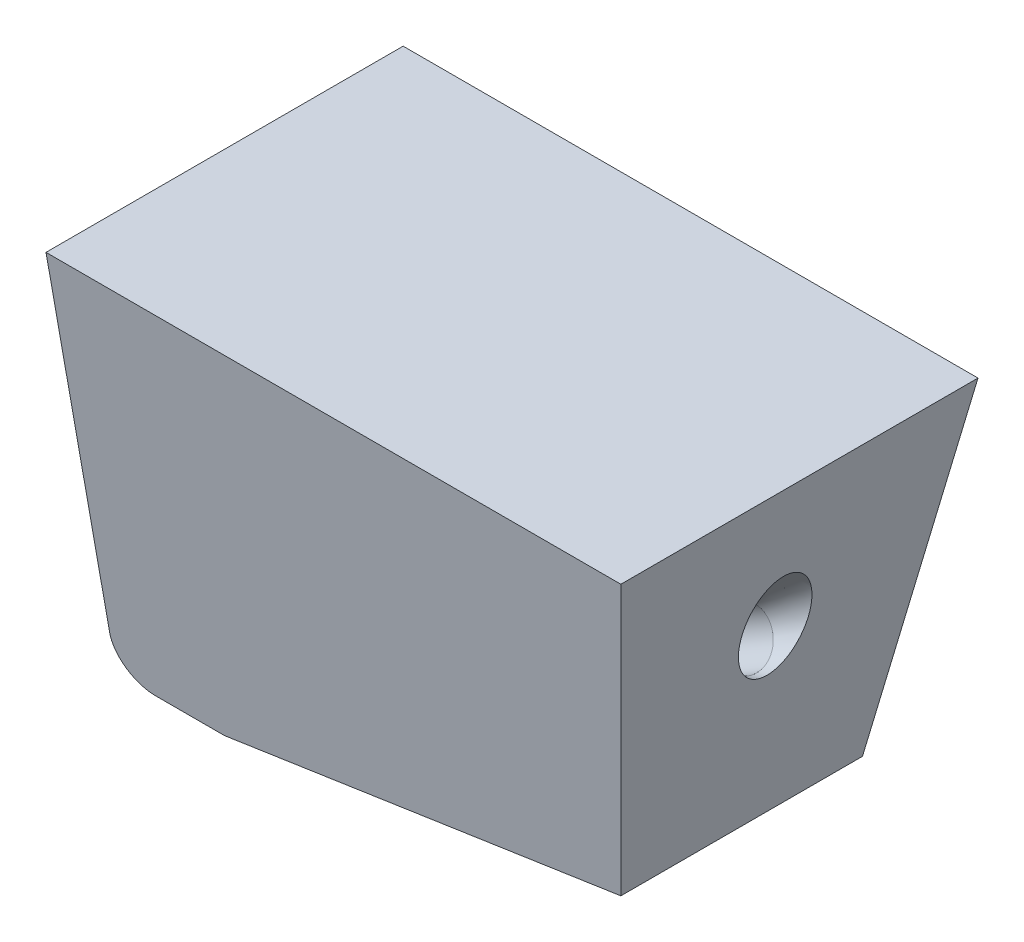
ISO-10303-21;
HEADER;
FILE_DESCRIPTION(('STEP AP214'),'2;1');
FILE_NAME('part.step','',(''),(''),'','','');
FILE_SCHEMA(('AUTOMOTIVE_DESIGN { 1 0 10303 214 1 1 1 1 }'));
ENDSEC;
DATA;
#1=APPLICATION_CONTEXT('core data for automotive mechanical design processes');
#2=APPLICATION_PROTOCOL_DEFINITION('international standard','automotive_design',2000,#1);
#3=PRODUCT_CONTEXT('',#1,'mechanical');
#4=PRODUCT('Part','Part','',(#3));
#5=PRODUCT_RELATED_PRODUCT_CATEGORY('part','',(#4));
#6=PRODUCT_DEFINITION_FORMATION('','',#4);
#7=PRODUCT_DEFINITION_CONTEXT('part definition',#1,'design');
#8=PRODUCT_DEFINITION('design','',#6,#7);
#9=PRODUCT_DEFINITION_SHAPE('','',#8);
#10=(LENGTH_UNIT() NAMED_UNIT(*) SI_UNIT(.MILLI.,.METRE.));
#11=(NAMED_UNIT(*) PLANE_ANGLE_UNIT() SI_UNIT($,.RADIAN.));
#12=(NAMED_UNIT(*) SI_UNIT($,.STERADIAN.) SOLID_ANGLE_UNIT());
#13=UNCERTAINTY_MEASURE_WITH_UNIT(LENGTH_MEASURE(1.E-05),#10,'distance_accuracy_value','');
#14=(GEOMETRIC_REPRESENTATION_CONTEXT(3) GLOBAL_UNCERTAINTY_ASSIGNED_CONTEXT((#13)) GLOBAL_UNIT_ASSIGNED_CONTEXT((#10,
#11,#12)) REPRESENTATION_CONTEXT('',''));
#15=CARTESIAN_POINT('',(0.,0.,0.));
#16=DIRECTION('',(0.,0.,1.));
#17=DIRECTION('',(1.,0.,0.));
#18=AXIS2_PLACEMENT_3D('',#15,#16,#17);
#19=CARTESIAN_POINT('',(26.8738719491216,0.,0.0762));
#20=DIRECTION('',(0.,-0.173648177666931,0.984807753012208));
#21=DIRECTION('',(0.,-0.984807753012208,-0.173648177666931));
#22=AXIS2_PLACEMENT_3D('',#19,#20,#21);
#23=PLANE('',#22);
#24=DIRECTION('',(-0.171087869746036,-0.970287525247814,-0.171087869746036));
#25=VECTOR('',#24,1.);
#26=CARTESIAN_POINT('',(0.766901483986011,4.46455489014234,0.863421483986016));
#27=LINE('',#26,#25);
#28=CARTESIAN_POINT('',(0.0293768307081209,0.28184473248759,0.125896830708121));
#29=VERTEX_POINT('',#28);
#30=CARTESIAN_POINT('',(-0.0113543651851166,0.0508466417269886,0.0851656348148851));
#31=VERTEX_POINT('',#30);
#32=EDGE_CURVE('E199',#29,#31,#27,.T.);
#33=ORIENTED_EDGE('',*,*,#32,.F.);
#34=DIRECTION('',(-1.,0.,0.));
#35=VECTOR('',#34,1.);
#36=CARTESIAN_POINT('',(26.8738719491216,0.28184473248759,0.125896830708122));
#37=LINE('',#36,#35);
#38=CARTESIAN_POINT('',(-0.37592,0.28184473248759,0.125896830708122));
#39=VERTEX_POINT('',#38);
#40=EDGE_CURVE('E62',#29,#39,#37,.T.);
#41=ORIENTED_EDGE('',*,*,#40,.T.);
#42=DIRECTION('',(0.,0.984807753012208,0.173648177666931));
#43=VECTOR('',#42,1.);
#44=CARTESIAN_POINT('',(-0.37592,20.2467685967878,3.64625157577457));
#45=LINE('',#44,#43);
#46=CARTESIAN_POINT('',(-0.37592,0.0255594358987837,0.080706818160645));
#47=VERTEX_POINT('',#46);
#48=EDGE_CURVE('E209',#47,#39,#45,.T.);
#49=ORIENTED_EDGE('',*,*,#48,.F.);
#50=CARTESIAN_POINT('',(-0.3480816,0.02794,0.0811265758409938));
#51=DIRECTION('',(0.,-0.173648177666931,0.984807753012208));
#52=DIRECTION('',(0.,-0.984807753012208,-0.173648177666931));
#53=AXIS2_PLACEMENT_3D('',#50,#51,#52);
#54=ELLIPSE('',#53,0.0283710195360877,0.02794);
#55=CARTESIAN_POINT('',(-0.3480816,0.,0.0761999999999992));
#56=VERTEX_POINT('',#55);
#57=EDGE_CURVE('E157',#56,#47,#54,.F.);
#58=ORIENTED_EDGE('',*,*,#57,.F.);
#59=DIRECTION('',(-1.,0.,0.));
#60=VECTOR('',#59,1.);
#61=CARTESIAN_POINT('',(26.8738719491216,0.,0.0762));
#62=LINE('',#61,#60);
#63=CARTESIAN_POINT('',(-0.299719999999993,0.,0.0762000000000001));
#64=VERTEX_POINT('',#63);
#65=EDGE_CURVE('E204',#64,#56,#62,.T.);
#66=ORIENTED_EDGE('',*,*,#65,.F.);
#67=DIRECTION('',(-0.984346441568213,-0.173566836012845,-0.0306045161452665));
#68=VECTOR('',#67,1.);
#69=CARTESIAN_POINT('',(26.0298035813508,4.64260539659194,0.894816592201888));
#70=LINE('',#69,#68);
#71=EDGE_CURVE('E201',#31,#64,#70,.T.);
#72=ORIENTED_EDGE('',*,*,#71,.F.);
#73=EDGE_LOOP('',(#33,#41,#49,#58,#66,#72));
#74=FACE_BOUND('',#73,.T.);
#75=ADVANCED_FACE('F45',(#74),#23,.T.);
#76=CARTESIAN_POINT('',(26.8738719491216,0.,-0.0762));
#77=DIRECTION('',(0.,-0.173648177666931,-0.984807753012208));
#78=DIRECTION('',(0.,0.984807753012208,-0.173648177666931));
#79=AXIS2_PLACEMENT_3D('',#76,#77,#78);
#80=PLANE('',#79);
#81=DIRECTION('',(0.,-0.984807753012208,0.173648177666931));
#82=VECTOR('',#81,1.);
#83=CARTESIAN_POINT('',(-0.37592,20.5212329145634,-3.69464704024015));
#84=LINE('',#83,#82);
#85=CARTESIAN_POINT('',(-0.37592,0.28184473248759,-0.125896830708122));
#86=VERTEX_POINT('',#85);
#87=CARTESIAN_POINT('',(-0.37592,0.0255594358987837,-0.0807068181606445));
#88=VERTEX_POINT('',#87);
#89=EDGE_CURVE('E49',#86,#88,#84,.T.);
#90=ORIENTED_EDGE('',*,*,#89,.F.);
#91=DIRECTION('',(1.,0.,0.));
#92=VECTOR('',#91,1.);
#93=CARTESIAN_POINT('',(26.8738719491216,0.28184473248759,-0.125896830708122));
#94=LINE('',#93,#92);
#95=CARTESIAN_POINT('',(0.029376830708121,0.28184473248759,-0.125896830708121));
#96=VERTEX_POINT('',#95);
#97=EDGE_CURVE('E142',#86,#96,#94,.T.);
#98=ORIENTED_EDGE('',*,*,#97,.T.);
#99=DIRECTION('',(0.171087869746036,0.970287525247814,-0.171087869746036));
#100=VECTOR('',#99,1.);
#101=CARTESIAN_POINT('',(0.766901483986011,4.46455489014234,-0.863421483986016));
#102=LINE('',#101,#100);
#103=CARTESIAN_POINT('',(-0.0113543651851166,0.0508466417269886,-0.0851656348148851));
#104=VERTEX_POINT('',#103);
#105=EDGE_CURVE('E131',#104,#96,#102,.T.);
#106=ORIENTED_EDGE('',*,*,#105,.F.);
#107=DIRECTION('',(0.984346441568213,0.173566836012845,-0.0306045161452665));
#108=VECTOR('',#107,1.);
#109=CARTESIAN_POINT('',(26.0298035813508,4.64260539659194,-0.894816592201888));
#110=LINE('',#109,#108);
#111=CARTESIAN_POINT('',(-0.299719999999993,0.,-0.0762000000000001));
#112=VERTEX_POINT('',#111);
#113=EDGE_CURVE('E139',#112,#104,#110,.T.);
#114=ORIENTED_EDGE('',*,*,#113,.F.);
#115=DIRECTION('',(-1.,0.,0.));
#116=VECTOR('',#115,1.);
#117=CARTESIAN_POINT('',(26.8738719491216,0.,-0.0762));
#118=LINE('',#117,#116);
#119=CARTESIAN_POINT('',(-0.3480816,0.,-0.0761999999999985));
#120=VERTEX_POINT('',#119);
#121=EDGE_CURVE('E207',#112,#120,#118,.T.);
#122=ORIENTED_EDGE('',*,*,#121,.T.);
#123=CARTESIAN_POINT('',(-0.3480816,0.02794,-0.0811265758409938));
#124=DIRECTION('',(0.,-0.173648177666931,-0.984807753012208));
#125=DIRECTION('',(0.,0.984807753012208,-0.173648177666931));
#126=AXIS2_PLACEMENT_3D('',#123,#124,#125);
#127=ELLIPSE('',#126,0.0283710195360877,0.02794);
#128=EDGE_CURVE('E55',#88,#120,#127,.F.);
#129=ORIENTED_EDGE('',*,*,#128,.F.);
#130=EDGE_LOOP('',(#90,#98,#106,#114,#122,#129));
#131=FACE_BOUND('',#130,.T.);
#132=ADVANCED_FACE('F143',(#131),#80,.T.);
#133=CARTESIAN_POINT('',(-0.37592,21.0312,-0.80247998));
#134=DIRECTION('',(-1.,0.,0.));
#135=DIRECTION('',(0.,0.,1.));
#136=AXIS2_PLACEMENT_3D('',#133,#134,#135);
#137=PLANE('',#136);
#138=ORIENTED_EDGE('',*,*,#48,.T.);
#139=DIRECTION('',(0.,0.,-1.));
#140=VECTOR('',#139,1.);
#141=CARTESIAN_POINT('',(-0.37592,0.281844732487591,-0.80247998));
#142=LINE('',#141,#140);
#143=EDGE_CURVE('E69',#39,#86,#142,.T.);
#144=ORIENTED_EDGE('',*,*,#143,.T.);
#145=ORIENTED_EDGE('',*,*,#89,.T.);
#146=DIRECTION('',(0.,0.,-1.));
#147=VECTOR('',#146,1.);
#148=CARTESIAN_POINT('',(-0.37592,0.0255594358987817,26.4277844491216));
#149=LINE('',#148,#147);
#150=EDGE_CURVE('E154',#47,#88,#149,.T.);
#151=ORIENTED_EDGE('',*,*,#150,.F.);
#152=EDGE_LOOP('',(#138,#144,#145,#151));
#153=FACE_BOUND('',#152,.T.);
#154=ADVANCED_FACE('F236',(#153),#137,.T.);
#155=CARTESIAN_POINT('',(-0.0113543651851151,0.0508466417269888,27.2760283406468));
#156=DIRECTION('',(-0.984807753012208,0.173648177666931,0.));
#157=DIRECTION('',(-0.173648177666931,-0.984807753012208,0.));
#158=AXIS2_PLACEMENT_3D('',#155,#156,#157);
#159=PLANE('',#158);
#160=CARTESIAN_POINT('',(0.0122922911853769,0.184953494095707,0.));
#161=DIRECTION('',(-0.984807753012208,0.173648177666931,0.));
#162=DIRECTION('',(0.173648177666931,0.984807753012208,0.));
#163=AXIS2_PLACEMENT_3D('',#160,#161,#162);
#164=ELLIPSE('',#163,0.0336182099567053,0.0252651922242437);
#165=CARTESIAN_POINT('',(0.0181300320807831,0.218060967903463,0.));
#166=VERTEX_POINT('',#165);
#167=EDGE_CURVE('E193',#166,#166,#164,.F.);
#168=ORIENTED_EDGE('',*,*,#167,.F.);
#169=EDGE_LOOP('',(#168));
#170=FACE_BOUND('',#169,.T.);
#171=DIRECTION('',(0.,0.,-1.));
#172=VECTOR('',#171,1.);
#173=CARTESIAN_POINT('',(0.0293768307081217,0.28184473248759,27.2760283406468));
#174=LINE('',#173,#172);
#175=EDGE_CURVE('E12',#29,#96,#174,.T.);
#176=ORIENTED_EDGE('',*,*,#175,.F.);
#177=ORIENTED_EDGE('',*,*,#32,.T.);
#178=DIRECTION('',(0.,0.,-1.));
#179=VECTOR('',#178,1.);
#180=CARTESIAN_POINT('',(-0.0113543651851151,0.0508466417269888,27.2760283406468));
#181=LINE('',#180,#179);
#182=EDGE_CURVE('E135',#31,#104,#181,.T.);
#183=ORIENTED_EDGE('',*,*,#182,.T.);
#184=ORIENTED_EDGE('',*,*,#105,.T.);
#185=EDGE_LOOP('',(#176,#177,#183,#184));
#186=FACE_BOUND('',#185,.T.);
#187=ADVANCED_FACE('F133',(#170,#186),#159,.F.);
#188=CARTESIAN_POINT('',(0.,0.,0.));
#189=DIRECTION('',(0.,1.,0.));
#190=DIRECTION('',(0.,0.,1.));
#191=AXIS2_PLACEMENT_3D('',#188,#189,#190);
#192=PLANE('',#191);
#193=ORIENTED_EDGE('',*,*,#65,.T.);
#194=DIRECTION('',(0.,0.,-1.));
#195=VECTOR('',#194,1.);
#196=CARTESIAN_POINT('',(-0.3480816,0.,26.4277844491216));
#197=LINE('',#196,#195);
#198=EDGE_CURVE('E149',#56,#120,#197,.T.);
#199=ORIENTED_EDGE('',*,*,#198,.T.);
#200=ORIENTED_EDGE('',*,*,#121,.F.);
#201=DIRECTION('',(0.,0.,-1.));
#202=VECTOR('',#201,1.);
#203=CARTESIAN_POINT('',(-0.29972,0.,27.2760283406468));
#204=LINE('',#203,#202);
#205=CARTESIAN_POINT('',(-0.29972,0.,-0.0190499999999996));
#206=VERTEX_POINT('',#205);
#207=EDGE_CURVE('E195',#206,#112,#204,.T.);
#208=ORIENTED_EDGE('',*,*,#207,.F.);
#209=DIRECTION('',(1.,0.,0.));
#210=VECTOR('',#209,1.);
#211=CARTESIAN_POINT('',(-0.1397,0.,-0.01905));
#212=LINE('',#211,#210);
#213=CARTESIAN_POINT('',(-0.303122954743875,0.,-0.01905));
#214=VERTEX_POINT('',#213);
#215=EDGE_CURVE('E182',#214,#206,#212,.T.);
#216=ORIENTED_EDGE('',*,*,#215,.F.);
#217=CARTESIAN_POINT('',(-0.303122954743875,0.,0.));
#218=DIRECTION('',(0.,1.,0.));
#219=DIRECTION('',(-1.,0.,0.));
#220=AXIS2_PLACEMENT_3D('',#217,#218,#219);
#221=ELLIPSE('',#220,0.0219970452561248,0.01905);
#222=CARTESIAN_POINT('',(-0.303122954743875,0.,0.01905));
#223=VERTEX_POINT('',#222);
#224=EDGE_CURVE('E191',#223,#214,#221,.F.);
#225=ORIENTED_EDGE('',*,*,#224,.F.);
#226=DIRECTION('',(1.,0.,0.));
#227=VECTOR('',#226,1.);
#228=CARTESIAN_POINT('',(-0.1397,0.,0.01905));
#229=LINE('',#228,#227);
#230=CARTESIAN_POINT('',(-0.29972,0.,0.0190499999999998));
#231=VERTEX_POINT('',#230);
#232=EDGE_CURVE('E173',#223,#231,#229,.T.);
#233=ORIENTED_EDGE('',*,*,#232,.T.);
#234=EDGE_CURVE('E196',#64,#231,#204,.T.);
#235=ORIENTED_EDGE('',*,*,#234,.F.);
#236=EDGE_LOOP('',(#193,#199,#200,#208,#216,#225,#233,#235));
#237=FACE_BOUND('',#236,.T.);
#238=ADVANCED_FACE('F47',(#237),#192,.F.);
#239=CARTESIAN_POINT('',(-0.29972,0.,27.2760283406468));
#240=DIRECTION('',(-0.173648177666931,0.984807753012208,0.));
#241=DIRECTION('',(-0.984807753012208,-0.173648177666931,0.));
#242=AXIS2_PLACEMENT_3D('',#239,#240,#241);
#243=PLANE('',#242);
#244=DIRECTION('',(-0.984807753012208,-0.173648177666931,0.));
#245=VECTOR('',#244,1.);
#246=CARTESIAN_POINT('',(-0.29972,0.,0.0190499999999996));
#247=LINE('',#246,#245);
#248=CARTESIAN_POINT('',(-0.1397,0.0282158434529687,0.0190499999999998));
#249=VERTEX_POINT('',#248);
#250=EDGE_CURVE('E216',#249,#231,#247,.T.);
#251=ORIENTED_EDGE('',*,*,#250,.F.);
#252=DIRECTION('',(0.,0.,1.));
#253=VECTOR('',#252,1.);
#254=CARTESIAN_POINT('',(-0.1397,0.0282158434529687,27.2760283406468));
#255=LINE('',#254,#253);
#256=CARTESIAN_POINT('',(-0.1397,0.0282158434529687,-0.0190499999999998));
#257=VERTEX_POINT('',#256);
#258=EDGE_CURVE('E218',#257,#249,#255,.T.);
#259=ORIENTED_EDGE('',*,*,#258,.F.);
#260=DIRECTION('',(-0.984807753012208,-0.173648177666931,0.));
#261=VECTOR('',#260,1.);
#262=CARTESIAN_POINT('',(-0.29972,0.,-0.0190499999999996));
#263=LINE('',#262,#261);
#264=EDGE_CURVE('E220',#257,#206,#263,.T.);
#265=ORIENTED_EDGE('',*,*,#264,.T.);
#266=ORIENTED_EDGE('',*,*,#207,.T.);
#267=ORIENTED_EDGE('',*,*,#113,.T.);
#268=ORIENTED_EDGE('',*,*,#182,.F.);
#269=ORIENTED_EDGE('',*,*,#71,.T.);
#270=ORIENTED_EDGE('',*,*,#234,.T.);
#271=EDGE_LOOP('',(#251,#259,#265,#266,#267,#268,#269,#270));
#272=FACE_BOUND('',#271,.T.);
#273=ADVANCED_FACE('F227',(#272),#243,.F.);
#274=CARTESIAN_POINT('',(-0.1397,0.09144,0.01905));
#275=DIRECTION('',(-1.,0.,0.));
#276=DIRECTION('',(0.,-1.,0.));
#277=AXIS2_PLACEMENT_3D('',#274,#275,#276);
#278=PLANE('',#277);
#279=ORIENTED_EDGE('',*,*,#258,.T.);
#280=DIRECTION('',(0.,1.,0.));
#281=VECTOR('',#280,1.);
#282=CARTESIAN_POINT('',(-0.1397,0.09144,0.01905));
#283=LINE('',#282,#281);
#284=CARTESIAN_POINT('',(-0.1397,0.09144,0.01905));
#285=VERTEX_POINT('',#284);
#286=EDGE_CURVE('E177',#249,#285,#283,.T.);
#287=ORIENTED_EDGE('',*,*,#286,.T.);
#288=CARTESIAN_POINT('',(-0.1397,0.0914400000000001,0.));
#289=DIRECTION('',(1.,0.,0.));
#290=DIRECTION('',(0.,1.,0.));
#291=AXIS2_PLACEMENT_3D('',#288,#289,#290);
#292=ELLIPSE('',#291,0.0219970452561247,0.01905);
#293=CARTESIAN_POINT('',(-0.1397,0.09144,-0.0190499999999996));
#294=VERTEX_POINT('',#293);
#295=EDGE_CURVE('E166',#294,#285,#292,.F.);
#296=ORIENTED_EDGE('',*,*,#295,.F.);
#297=DIRECTION('',(0.,1.,0.));
#298=VECTOR('',#297,1.);
#299=CARTESIAN_POINT('',(-0.1397,0.09144,-0.01905));
#300=LINE('',#299,#298);
#301=EDGE_CURVE('E174',#257,#294,#300,.T.);
#302=ORIENTED_EDGE('',*,*,#301,.F.);
#303=EDGE_LOOP('',(#279,#287,#296,#302));
#304=FACE_BOUND('',#303,.T.);
#305=ADVANCED_FACE('F249',(#304),#278,.T.);
#306=CARTESIAN_POINT('',(0.,0.,0.01905));
#307=DIRECTION('',(0.,0.,-1.));
#308=DIRECTION('',(-1.,0.,0.));
#309=AXIS2_PLACEMENT_3D('',#306,#307,#308);
#310=PLANE('',#309);
#311=ORIENTED_EDGE('',*,*,#250,.T.);
#312=ORIENTED_EDGE('',*,*,#232,.F.);
#313=DIRECTION('',(-0.500000000000004,-0.866025403784436,0.));
#314=VECTOR('',#313,1.);
#315=CARTESIAN_POINT('',(-0.227342216057905,0.131256089639199,0.01905));
#316=LINE('',#315,#314);
#317=CARTESIAN_POINT('',(-0.250330046129175,0.09144,0.01905));
#318=VERTEX_POINT('',#317);
#319=EDGE_CURVE('E179',#318,#223,#316,.T.);
#320=ORIENTED_EDGE('',*,*,#319,.F.);
#321=DIRECTION('',(-1.,0.,0.));
#322=VECTOR('',#321,1.);
#323=CARTESIAN_POINT('',(-0.2723270913853,0.09144,0.01905));
#324=LINE('',#323,#322);
#325=EDGE_CURVE('E170',#285,#318,#324,.T.);
#326=ORIENTED_EDGE('',*,*,#325,.F.);
#327=ORIENTED_EDGE('',*,*,#286,.F.);
#328=EDGE_LOOP('',(#311,#312,#320,#326,#327));
#329=FACE_BOUND('',#328,.T.);
#330=ADVANCED_FACE('F243',(#329),#310,.T.);
#331=CARTESIAN_POINT('',(0.,0.,-0.01905));
#332=DIRECTION('',(0.,0.,-1.));
#333=DIRECTION('',(-1.,0.,0.));
#334=AXIS2_PLACEMENT_3D('',#331,#332,#333);
#335=PLANE('',#334);
#336=ORIENTED_EDGE('',*,*,#301,.T.);
#337=DIRECTION('',(-1.,0.,0.));
#338=VECTOR('',#337,1.);
#339=CARTESIAN_POINT('',(-0.2723270913853,0.09144,-0.01905));
#340=LINE('',#339,#338);
#341=CARTESIAN_POINT('',(-0.250330046129175,0.09144,-0.01905));
#342=VERTEX_POINT('',#341);
#343=EDGE_CURVE('E169',#294,#342,#340,.T.);
#344=ORIENTED_EDGE('',*,*,#343,.T.);
#345=DIRECTION('',(0.500000000000004,0.866025403784436,0.));
#346=VECTOR('',#345,1.);
#347=CARTESIAN_POINT('',(-0.250330046129175,0.09144,-0.01905));
#348=LINE('',#347,#346);
#349=EDGE_CURVE('E186',#214,#342,#348,.T.);
#350=ORIENTED_EDGE('',*,*,#349,.F.);
#351=ORIENTED_EDGE('',*,*,#215,.T.);
#352=ORIENTED_EDGE('',*,*,#264,.F.);
#353=EDGE_LOOP('',(#336,#344,#350,#351,#352));
#354=FACE_BOUND('',#353,.T.);
#355=ADVANCED_FACE('F265',(#354),#335,.F.);
#356=CARTESIAN_POINT('',(-0.0103574919504674,0.166115931840058,0.));
#357=DIRECTION('',(0.866025403784441,0.499999999999995,0.));
#358=DIRECTION('',(-0.499999999999995,0.866025403784441,0.));
#359=AXIS2_PLACEMENT_3D('',#356,#357,#358);
#360=CONICAL_SURFACE('',#359,0.01905,0.226892802759263);
#361=CARTESIAN_POINT('',(-0.0103574919504674,0.166115931840058,0.));
#362=DIRECTION('',(0.866025403784441,0.499999999999995,0.));
#363=DIRECTION('',(-0.499999999999995,0.866025403784441,0.));
#364=AXIS2_PLACEMENT_3D('',#361,#362,#363);
#365=CIRCLE('',#364,0.01905);
#366=CARTESIAN_POINT('',(-0.0198824919504673,0.182613715782152,0.));
#367=VERTEX_POINT('',#366);
#368=EDGE_CURVE('E160',#367,#367,#365,.T.);
#369=ORIENTED_EDGE('',*,*,#368,.F.);
#370=EDGE_LOOP('',(#369));
#371=FACE_BOUND('',#370,.T.);
#372=ORIENTED_EDGE('',*,*,#167,.T.);
#373=EDGE_LOOP('',(#372));
#374=FACE_BOUND('',#373,.T.);
#375=ADVANCED_FACE('F261',(#371,#374),#360,.F.);
#376=CARTESIAN_POINT('',(-0.250330046129175,0.09144,0.));
#377=DIRECTION('',(-0.500000000000004,-0.866025403784436,0.));
#378=DIRECTION('',(0.866025403784436,-0.500000000000004,0.));
#379=AXIS2_PLACEMENT_3D('',#376,#377,#378);
#380=CYLINDRICAL_SURFACE('',#379,0.01905);
#381=ORIENTED_EDGE('',*,*,#319,.T.);
#382=ORIENTED_EDGE('',*,*,#224,.T.);
#383=ORIENTED_EDGE('',*,*,#349,.T.);
#384=CARTESIAN_POINT('',(-0.250330046129175,0.09144,0.));
#385=DIRECTION('',(0.,-1.,0.));
#386=DIRECTION('',(-1.,0.,0.));
#387=AXIS2_PLACEMENT_3D('',#384,#385,#386);
#388=ELLIPSE('',#387,0.0219970452561248,0.01905);
#389=EDGE_CURVE('E189',#342,#318,#388,.F.);
#390=ORIENTED_EDGE('',*,*,#389,.T.);
#391=EDGE_LOOP('',(#381,#382,#383,#390));
#392=FACE_BOUND('',#391,.T.);
#393=ADVANCED_FACE('F264',(#392),#380,.F.);
#394=CARTESIAN_POINT('',(-0.2723270913853,0.09144,0.01905));
#395=DIRECTION('',(0.,-1.,0.));
#396=DIRECTION('',(0.,0.,-1.));
#397=AXIS2_PLACEMENT_3D('',#394,#395,#396);
#398=PLANE('',#397);
#399=ORIENTED_EDGE('',*,*,#343,.F.);
#400=CARTESIAN_POINT('',(-0.1397,0.09144,0.));
#401=DIRECTION('',(0.,1.,0.));
#402=DIRECTION('',(1.,0.,0.));
#403=AXIS2_PLACEMENT_3D('',#400,#401,#402);
#404=ELLIPSE('',#403,0.0381000000000004,0.01905);
#405=EDGE_CURVE('E163',#285,#294,#404,.F.);
#406=ORIENTED_EDGE('',*,*,#405,.F.);
#407=ORIENTED_EDGE('',*,*,#325,.T.);
#408=ORIENTED_EDGE('',*,*,#389,.F.);
#409=EDGE_LOOP('',(#399,#406,#407,#408));
#410=FACE_BOUND('',#409,.T.);
#411=ADVANCED_FACE('F253',(#410),#398,.T.);
#412=CARTESIAN_POINT('',(-0.36807289524413,-0.0404111525448111,0.));
#413=DIRECTION('',(0.866025403784441,0.499999999999995,0.));
#414=DIRECTION('',(-0.499999999999995,0.866025403784441,0.));
#415=AXIS2_PLACEMENT_3D('',#412,#413,#414);
#416=CYLINDRICAL_SURFACE('',#415,0.01905);
#417=ORIENTED_EDGE('',*,*,#295,.T.);
#418=ORIENTED_EDGE('',*,*,#405,.T.);
#419=EDGE_LOOP('',(#417,#418));
#420=FACE_BOUND('',#419,.T.);
#421=ORIENTED_EDGE('',*,*,#368,.T.);
#422=EDGE_LOOP('',(#421));
#423=FACE_BOUND('',#422,.T.);
#424=ADVANCED_FACE('F255',(#420,#423),#416,.F.);
#425=CARTESIAN_POINT('',(-0.3480816,0.02794,26.4277844491216));
#426=DIRECTION('',(0.,0.,-1.));
#427=DIRECTION('',(-1.,0.,0.));
#428=AXIS2_PLACEMENT_3D('',#425,#426,#427);
#429=CYLINDRICAL_SURFACE('',#428,0.02794);
#430=ORIENTED_EDGE('',*,*,#198,.F.);
#431=ORIENTED_EDGE('',*,*,#57,.T.);
#432=ORIENTED_EDGE('',*,*,#150,.T.);
#433=ORIENTED_EDGE('',*,*,#128,.T.);
#434=EDGE_LOOP('',(#430,#431,#432,#433));
#435=FACE_BOUND('',#434,.T.);
#436=ADVANCED_FACE('F235',(#435),#429,.T.);
#437=CARTESIAN_POINT('',(0.,0.28184473248759,0.));
#438=DIRECTION('',(0.,1.,0.));
#439=DIRECTION('',(0.,0.,1.));
#440=AXIS2_PLACEMENT_3D('',#437,#438,#439);
#441=PLANE('',#440);
#442=ORIENTED_EDGE('',*,*,#143,.F.);
#443=ORIENTED_EDGE('',*,*,#40,.F.);
#444=ORIENTED_EDGE('',*,*,#175,.T.);
#445=ORIENTED_EDGE('',*,*,#97,.F.);
#446=EDGE_LOOP('',(#442,#443,#444,#445));
#447=FACE_BOUND('',#446,.T.);
#448=ADVANCED_FACE('F147',(#447),#441,.T.);
#449=CLOSED_SHELL('',(#75,#132,#154,#187,#238,#273,#305,#330,#355,#375,#393,#411,#424,#436,#448));
#450=MANIFOLD_SOLID_BREP('B2',#449);
#451=ADVANCED_BREP_SHAPE_REPRESENTATION('',(#18,#450),#14);
#452=SHAPE_DEFINITION_REPRESENTATION(#9,#451);
ENDSEC;
END-ISO-10303-21;
